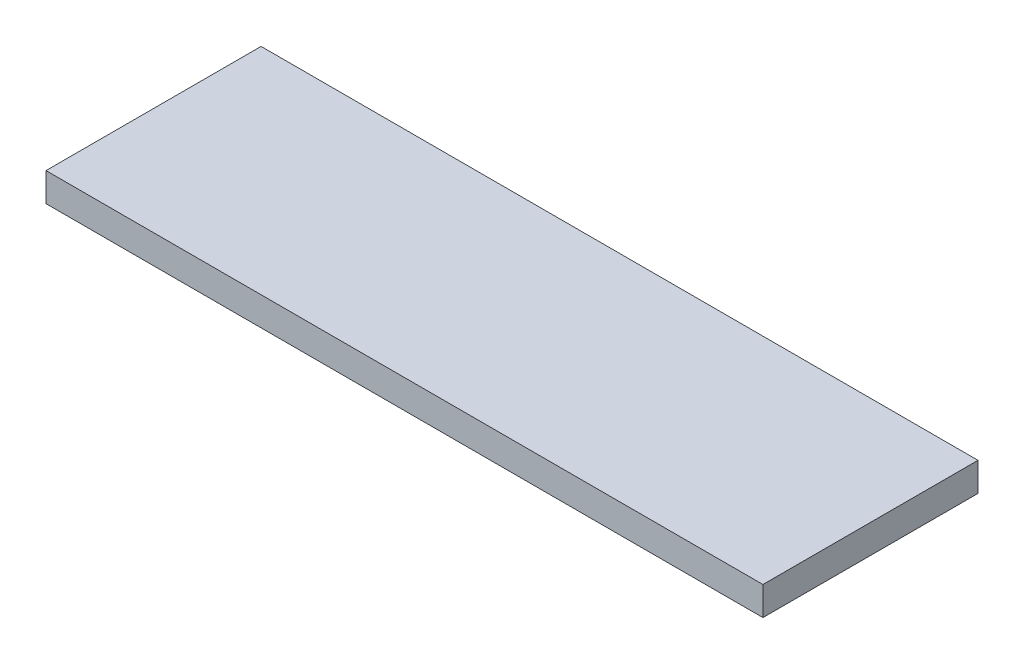
ISO-10303-21;
HEADER;
FILE_DESCRIPTION(('STEP AP214'),'2;1');
FILE_NAME('part.step','',(''),(''),'','','');
FILE_SCHEMA(('AUTOMOTIVE_DESIGN { 1 0 10303 214 1 1 1 1 }'));
ENDSEC;
DATA;
#1=APPLICATION_CONTEXT('core data for automotive mechanical design processes');
#2=APPLICATION_PROTOCOL_DEFINITION('international standard','automotive_design',2000,#1);
#3=PRODUCT_CONTEXT('',#1,'mechanical');
#4=PRODUCT('Part','Part','',(#3));
#5=PRODUCT_RELATED_PRODUCT_CATEGORY('part','',(#4));
#6=PRODUCT_DEFINITION_FORMATION('','',#4);
#7=PRODUCT_DEFINITION_CONTEXT('part definition',#1,'design');
#8=PRODUCT_DEFINITION('design','',#6,#7);
#9=PRODUCT_DEFINITION_SHAPE('','',#8);
#10=(LENGTH_UNIT() NAMED_UNIT(*) SI_UNIT(.MILLI.,.METRE.));
#11=(NAMED_UNIT(*) PLANE_ANGLE_UNIT() SI_UNIT($,.RADIAN.));
#12=(NAMED_UNIT(*) SI_UNIT($,.STERADIAN.) SOLID_ANGLE_UNIT());
#13=UNCERTAINTY_MEASURE_WITH_UNIT(LENGTH_MEASURE(1.E-05),#10,'distance_accuracy_value','');
#14=(GEOMETRIC_REPRESENTATION_CONTEXT(3) GLOBAL_UNCERTAINTY_ASSIGNED_CONTEXT((#13)) GLOBAL_UNIT_ASSIGNED_CONTEXT((#10,
#11,#12)) REPRESENTATION_CONTEXT('',''));
#15=CARTESIAN_POINT('',(0.,0.,0.));
#16=DIRECTION('',(0.,0.,1.));
#17=DIRECTION('',(1.,0.,0.));
#18=AXIS2_PLACEMENT_3D('',#15,#16,#17);
#19=CARTESIAN_POINT('',(0.,2.,0.));
#20=DIRECTION('',(1.,0.,0.));
#21=DIRECTION('',(0.,0.,-1.));
#22=AXIS2_PLACEMENT_3D('',#19,#20,#21);
#23=PLANE('',#22);
#24=DIRECTION('',(0.,0.,1.));
#25=VECTOR('',#24,1.);
#26=CARTESIAN_POINT('',(0.,0.,0.));
#27=LINE('',#26,#25);
#28=CARTESIAN_POINT('',(0.,0.,-15.));
#29=VERTEX_POINT('',#28);
#30=CARTESIAN_POINT('',(0.,0.,0.));
#31=VERTEX_POINT('',#30);
#32=EDGE_CURVE('E98',#29,#31,#27,.T.);
#33=ORIENTED_EDGE('',*,*,#32,.T.);
#34=DIRECTION('',(0.,-1.,0.));
#35=VECTOR('',#34,1.);
#36=CARTESIAN_POINT('',(0.,2.,0.));
#37=LINE('',#36,#35);
#38=CARTESIAN_POINT('',(0.,2.,0.));
#39=VERTEX_POINT('',#38);
#40=EDGE_CURVE('E11',#39,#31,#37,.T.);
#41=ORIENTED_EDGE('',*,*,#40,.F.);
#42=DIRECTION('',(0.,0.,1.));
#43=VECTOR('',#42,1.);
#44=CARTESIAN_POINT('',(0.,2.,0.));
#45=LINE('',#44,#43);
#46=CARTESIAN_POINT('',(0.,2.,-15.));
#47=VERTEX_POINT('',#46);
#48=EDGE_CURVE('E86',#47,#39,#45,.T.);
#49=ORIENTED_EDGE('',*,*,#48,.F.);
#50=DIRECTION('',(0.,-1.,0.));
#51=VECTOR('',#50,1.);
#52=CARTESIAN_POINT('',(0.,2.,-15.));
#53=LINE('',#52,#51);
#54=EDGE_CURVE('E94',#47,#29,#53,.T.);
#55=ORIENTED_EDGE('',*,*,#54,.T.);
#56=EDGE_LOOP('',(#33,#41,#49,#55));
#57=FACE_BOUND('',#56,.T.);
#58=ADVANCED_FACE('F35',(#57),#23,.F.);
#59=CARTESIAN_POINT('',(0.,2.,0.));
#60=DIRECTION('',(0.,0.,-1.));
#61=DIRECTION('',(-1.,0.,0.));
#62=AXIS2_PLACEMENT_3D('',#59,#60,#61);
#63=PLANE('',#62);
#64=DIRECTION('',(1.,0.,0.));
#65=VECTOR('',#64,1.);
#66=CARTESIAN_POINT('',(0.,0.,0.));
#67=LINE('',#66,#65);
#68=CARTESIAN_POINT('',(50.,0.,0.));
#69=VERTEX_POINT('',#68);
#70=EDGE_CURVE('E90',#31,#69,#67,.T.);
#71=ORIENTED_EDGE('',*,*,#70,.T.);
#72=DIRECTION('',(0.,-1.,0.));
#73=VECTOR('',#72,1.);
#74=CARTESIAN_POINT('',(50.,2.,0.));
#75=LINE('',#74,#73);
#76=CARTESIAN_POINT('',(50.,2.,0.));
#77=VERTEX_POINT('',#76);
#78=EDGE_CURVE('E43',#77,#69,#75,.T.);
#79=ORIENTED_EDGE('',*,*,#78,.F.);
#80=DIRECTION('',(1.,0.,0.));
#81=VECTOR('',#80,1.);
#82=CARTESIAN_POINT('',(0.,2.,0.));
#83=LINE('',#82,#81);
#84=EDGE_CURVE('E81',#39,#77,#83,.T.);
#85=ORIENTED_EDGE('',*,*,#84,.F.);
#86=ORIENTED_EDGE('',*,*,#40,.T.);
#87=EDGE_LOOP('',(#71,#79,#85,#86));
#88=FACE_BOUND('',#87,.T.);
#89=ADVANCED_FACE('F89',(#88),#63,.F.);
#90=CARTESIAN_POINT('',(50.,2.,0.));
#91=DIRECTION('',(-1.,0.,0.));
#92=DIRECTION('',(0.,0.,1.));
#93=AXIS2_PLACEMENT_3D('',#90,#91,#92);
#94=PLANE('',#93);
#95=DIRECTION('',(0.,0.,-1.));
#96=VECTOR('',#95,1.);
#97=CARTESIAN_POINT('',(50.,0.,0.));
#98=LINE('',#97,#96);
#99=CARTESIAN_POINT('',(50.,0.,-15.));
#100=VERTEX_POINT('',#99);
#101=EDGE_CURVE('E68',#69,#100,#98,.T.);
#102=ORIENTED_EDGE('',*,*,#101,.T.);
#103=DIRECTION('',(0.,-1.,0.));
#104=VECTOR('',#103,1.);
#105=CARTESIAN_POINT('',(50.,2.,-15.));
#106=LINE('',#105,#104);
#107=CARTESIAN_POINT('',(50.,2.,-15.));
#108=VERTEX_POINT('',#107);
#109=EDGE_CURVE('E91',#108,#100,#106,.T.);
#110=ORIENTED_EDGE('',*,*,#109,.F.);
#111=DIRECTION('',(0.,0.,-1.));
#112=VECTOR('',#111,1.);
#113=CARTESIAN_POINT('',(50.,2.,0.));
#114=LINE('',#113,#112);
#115=EDGE_CURVE('E84',#77,#108,#114,.T.);
#116=ORIENTED_EDGE('',*,*,#115,.F.);
#117=ORIENTED_EDGE('',*,*,#78,.T.);
#118=EDGE_LOOP('',(#102,#110,#116,#117));
#119=FACE_BOUND('',#118,.T.);
#120=ADVANCED_FACE('F92',(#119),#94,.F.);
#121=CARTESIAN_POINT('',(0.,2.,-15.));
#122=DIRECTION('',(0.,0.,1.));
#123=DIRECTION('',(1.,0.,0.));
#124=AXIS2_PLACEMENT_3D('',#121,#122,#123);
#125=PLANE('',#124);
#126=DIRECTION('',(-1.,0.,0.));
#127=VECTOR('',#126,1.);
#128=CARTESIAN_POINT('',(0.,0.,-15.));
#129=LINE('',#128,#127);
#130=EDGE_CURVE('E74',#100,#29,#129,.T.);
#131=ORIENTED_EDGE('',*,*,#130,.T.);
#132=ORIENTED_EDGE('',*,*,#54,.F.);
#133=DIRECTION('',(-1.,0.,0.));
#134=VECTOR('',#133,1.);
#135=CARTESIAN_POINT('',(0.,2.,-15.));
#136=LINE('',#135,#134);
#137=EDGE_CURVE('E51',#108,#47,#136,.T.);
#138=ORIENTED_EDGE('',*,*,#137,.F.);
#139=ORIENTED_EDGE('',*,*,#109,.T.);
#140=EDGE_LOOP('',(#131,#132,#138,#139));
#141=FACE_BOUND('',#140,.T.);
#142=ADVANCED_FACE('F105',(#141),#125,.F.);
#143=CARTESIAN_POINT('',(0.,2.,0.));
#144=DIRECTION('',(0.,-1.,0.));
#145=DIRECTION('',(0.,0.,-1.));
#146=AXIS2_PLACEMENT_3D('',#143,#144,#145);
#147=PLANE('',#146);
#148=ORIENTED_EDGE('',*,*,#48,.T.);
#149=ORIENTED_EDGE('',*,*,#84,.T.);
#150=ORIENTED_EDGE('',*,*,#115,.T.);
#151=ORIENTED_EDGE('',*,*,#137,.T.);
#152=EDGE_LOOP('',(#148,#149,#150,#151));
#153=FACE_BOUND('',#152,.T.);
#154=ADVANCED_FACE('F82',(#153),#147,.F.);
#155=CARTESIAN_POINT('',(0.,0.,0.));
#156=DIRECTION('',(0.,-1.,0.));
#157=DIRECTION('',(0.,0.,-1.));
#158=AXIS2_PLACEMENT_3D('',#155,#156,#157);
#159=PLANE('',#158);
#160=ORIENTED_EDGE('',*,*,#32,.F.);
#161=ORIENTED_EDGE('',*,*,#130,.F.);
#162=ORIENTED_EDGE('',*,*,#101,.F.);
#163=ORIENTED_EDGE('',*,*,#70,.F.);
#164=EDGE_LOOP('',(#160,#161,#162,#163));
#165=FACE_BOUND('',#164,.T.);
#166=ADVANCED_FACE('F108',(#165),#159,.T.);
#167=CLOSED_SHELL('',(#58,#89,#120,#142,#154,#166));
#168=MANIFOLD_SOLID_BREP('B2',#167);
#169=ADVANCED_BREP_SHAPE_REPRESENTATION('',(#18,#168),#14);
#170=SHAPE_DEFINITION_REPRESENTATION(#9,#169);
ENDSEC;
END-ISO-10303-21;
